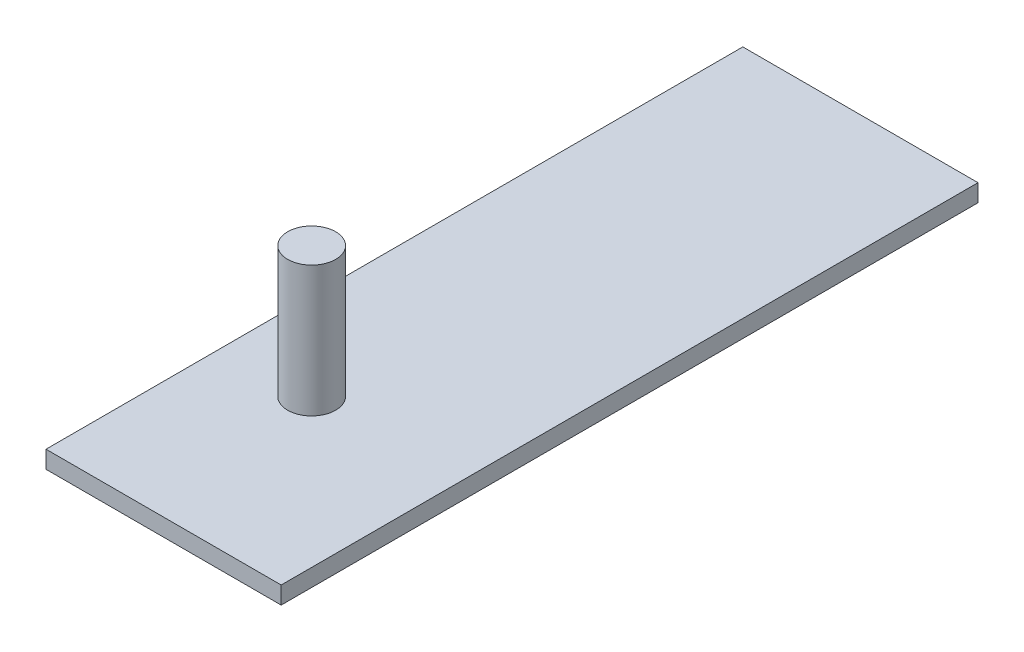
ISO-10303-21;
HEADER;
FILE_DESCRIPTION(('STEP AP214'),'2;1');
FILE_NAME('part.step','',(''),(''),'','','');
FILE_SCHEMA(('AUTOMOTIVE_DESIGN { 1 0 10303 214 1 1 1 1 }'));
ENDSEC;
DATA;
#1=APPLICATION_CONTEXT('core data for automotive mechanical design processes');
#2=APPLICATION_PROTOCOL_DEFINITION('international standard','automotive_design',2000,#1);
#3=PRODUCT_CONTEXT('',#1,'mechanical');
#4=PRODUCT('Part','Part','',(#3));
#5=PRODUCT_RELATED_PRODUCT_CATEGORY('part','',(#4));
#6=PRODUCT_DEFINITION_FORMATION('','',#4);
#7=PRODUCT_DEFINITION_CONTEXT('part definition',#1,'design');
#8=PRODUCT_DEFINITION('design','',#6,#7);
#9=PRODUCT_DEFINITION_SHAPE('','',#8);
#10=(LENGTH_UNIT() NAMED_UNIT(*) SI_UNIT(.MILLI.,.METRE.));
#11=(NAMED_UNIT(*) PLANE_ANGLE_UNIT() SI_UNIT($,.RADIAN.));
#12=(NAMED_UNIT(*) SI_UNIT($,.STERADIAN.) SOLID_ANGLE_UNIT());
#13=UNCERTAINTY_MEASURE_WITH_UNIT(LENGTH_MEASURE(1.E-05),#10,'distance_accuracy_value','');
#14=(GEOMETRIC_REPRESENTATION_CONTEXT(3) GLOBAL_UNCERTAINTY_ASSIGNED_CONTEXT((#13)) GLOBAL_UNIT_ASSIGNED_CONTEXT((#10,
#11,#12)) REPRESENTATION_CONTEXT('',''));
#15=CARTESIAN_POINT('',(0.,0.,0.));
#16=DIRECTION('',(0.,0.,1.));
#17=DIRECTION('',(1.,0.,0.));
#18=AXIS2_PLACEMENT_3D('',#15,#16,#17);
#19=CARTESIAN_POINT('',(0.,2.,0.));
#20=DIRECTION('',(0.,1.,0.));
#21=DIRECTION('',(0.,0.,1.));
#22=AXIS2_PLACEMENT_3D('',#19,#20,#21);
#23=PLANE('',#22);
#24=DIRECTION('',(0.,0.,1.));
#25=VECTOR('',#24,1.);
#26=CARTESIAN_POINT('',(-13.5,2.,40.));
#27=LINE('',#26,#25);
#28=CARTESIAN_POINT('',(-13.5,2.,-40.));
#29=VERTEX_POINT('',#28);
#30=CARTESIAN_POINT('',(-13.5,2.,40.));
#31=VERTEX_POINT('',#30);
#32=EDGE_CURVE('E87',#29,#31,#27,.T.);
#33=ORIENTED_EDGE('',*,*,#32,.T.);
#34=DIRECTION('',(1.,0.,0.));
#35=VECTOR('',#34,1.);
#36=CARTESIAN_POINT('',(13.5,2.,40.));
#37=LINE('',#36,#35);
#38=CARTESIAN_POINT('',(13.5,2.,40.));
#39=VERTEX_POINT('',#38);
#40=EDGE_CURVE('E82',#31,#39,#37,.T.);
#41=ORIENTED_EDGE('',*,*,#40,.T.);
#42=DIRECTION('',(0.,0.,-1.));
#43=VECTOR('',#42,1.);
#44=CARTESIAN_POINT('',(13.5,2.,40.));
#45=LINE('',#44,#43);
#46=CARTESIAN_POINT('',(13.5,2.,-40.));
#47=VERTEX_POINT('',#46);
#48=EDGE_CURVE('E85',#39,#47,#45,.T.);
#49=ORIENTED_EDGE('',*,*,#48,.T.);
#50=DIRECTION('',(-1.,0.,0.));
#51=VECTOR('',#50,1.);
#52=CARTESIAN_POINT('',(13.5,2.,-40.));
#53=LINE('',#52,#51);
#54=EDGE_CURVE('E52',#47,#29,#53,.T.);
#55=ORIENTED_EDGE('',*,*,#54,.T.);
#56=EDGE_LOOP('',(#33,#41,#49,#55));
#57=FACE_BOUND('',#56,.T.);
#58=CARTESIAN_POINT('',(-3.49999999999999,2.,19.5));
#59=DIRECTION('',(0.,1.,0.));
#60=DIRECTION('',(0.,0.,1.));
#61=AXIS2_PLACEMENT_3D('',#58,#59,#60);
#62=CIRCLE('',#61,2.75357296874713);
#63=CARTESIAN_POINT('',(-3.49999999999999,2.,22.2535729687471));
#64=VERTEX_POINT('',#63);
#65=EDGE_CURVE('E113',#64,#64,#62,.T.);
#66=ORIENTED_EDGE('',*,*,#65,.F.);
#67=EDGE_LOOP('',(#66));
#68=FACE_BOUND('',#67,.T.);
#69=ADVANCED_FACE('F35',(#57,#68),#23,.T.);
#70=CARTESIAN_POINT('',(-13.5,2.,40.));
#71=DIRECTION('',(1.,0.,0.));
#72=DIRECTION('',(0.,0.,-1.));
#73=AXIS2_PLACEMENT_3D('',#70,#71,#72);
#74=PLANE('',#73);
#75=DIRECTION('',(0.,0.,1.));
#76=VECTOR('',#75,1.);
#77=CARTESIAN_POINT('',(-13.5,0.,40.));
#78=LINE('',#77,#76);
#79=CARTESIAN_POINT('',(-13.5,0.,-40.));
#80=VERTEX_POINT('',#79);
#81=CARTESIAN_POINT('',(-13.5,0.,40.));
#82=VERTEX_POINT('',#81);
#83=EDGE_CURVE('E99',#80,#82,#78,.T.);
#84=ORIENTED_EDGE('',*,*,#83,.T.);
#85=DIRECTION('',(0.,-1.,0.));
#86=VECTOR('',#85,1.);
#87=CARTESIAN_POINT('',(-13.5,2.,40.));
#88=LINE('',#87,#86);
#89=EDGE_CURVE('E11',#31,#82,#88,.T.);
#90=ORIENTED_EDGE('',*,*,#89,.F.);
#91=ORIENTED_EDGE('',*,*,#32,.F.);
#92=DIRECTION('',(0.,-1.,0.));
#93=VECTOR('',#92,1.);
#94=CARTESIAN_POINT('',(-13.5,2.,-40.));
#95=LINE('',#94,#93);
#96=EDGE_CURVE('E95',#29,#80,#95,.T.);
#97=ORIENTED_EDGE('',*,*,#96,.T.);
#98=EDGE_LOOP('',(#84,#90,#91,#97));
#99=FACE_BOUND('',#98,.T.);
#100=ADVANCED_FACE('F37',(#99),#74,.F.);
#101=CARTESIAN_POINT('',(13.5,2.,40.));
#102=DIRECTION('',(0.,0.,-1.));
#103=DIRECTION('',(-1.,0.,0.));
#104=AXIS2_PLACEMENT_3D('',#101,#102,#103);
#105=PLANE('',#104);
#106=DIRECTION('',(1.,0.,0.));
#107=VECTOR('',#106,1.);
#108=CARTESIAN_POINT('',(13.5,0.,40.));
#109=LINE('',#108,#107);
#110=CARTESIAN_POINT('',(13.5,0.,40.));
#111=VERTEX_POINT('',#110);
#112=EDGE_CURVE('E91',#82,#111,#109,.T.);
#113=ORIENTED_EDGE('',*,*,#112,.T.);
#114=DIRECTION('',(0.,-1.,0.));
#115=VECTOR('',#114,1.);
#116=CARTESIAN_POINT('',(13.5,2.,40.));
#117=LINE('',#116,#115);
#118=EDGE_CURVE('E44',#39,#111,#117,.T.);
#119=ORIENTED_EDGE('',*,*,#118,.F.);
#120=ORIENTED_EDGE('',*,*,#40,.F.);
#121=ORIENTED_EDGE('',*,*,#89,.T.);
#122=EDGE_LOOP('',(#113,#119,#120,#121));
#123=FACE_BOUND('',#122,.T.);
#124=ADVANCED_FACE('F90',(#123),#105,.F.);
#125=CARTESIAN_POINT('',(13.5,2.,40.));
#126=DIRECTION('',(-1.,0.,0.));
#127=DIRECTION('',(0.,0.,1.));
#128=AXIS2_PLACEMENT_3D('',#125,#126,#127);
#129=PLANE('',#128);
#130=DIRECTION('',(0.,0.,-1.));
#131=VECTOR('',#130,1.);
#132=CARTESIAN_POINT('',(13.5,0.,40.));
#133=LINE('',#132,#131);
#134=CARTESIAN_POINT('',(13.5,0.,-40.));
#135=VERTEX_POINT('',#134);
#136=EDGE_CURVE('E69',#111,#135,#133,.T.);
#137=ORIENTED_EDGE('',*,*,#136,.T.);
#138=DIRECTION('',(0.,-1.,0.));
#139=VECTOR('',#138,1.);
#140=CARTESIAN_POINT('',(13.5,2.,-40.));
#141=LINE('',#140,#139);
#142=EDGE_CURVE('E92',#47,#135,#141,.T.);
#143=ORIENTED_EDGE('',*,*,#142,.F.);
#144=ORIENTED_EDGE('',*,*,#48,.F.);
#145=ORIENTED_EDGE('',*,*,#118,.T.);
#146=EDGE_LOOP('',(#137,#143,#144,#145));
#147=FACE_BOUND('',#146,.T.);
#148=ADVANCED_FACE('F93',(#147),#129,.F.);
#149=CARTESIAN_POINT('',(13.5,2.,-40.));
#150=DIRECTION('',(0.,0.,1.));
#151=DIRECTION('',(1.,0.,0.));
#152=AXIS2_PLACEMENT_3D('',#149,#150,#151);
#153=PLANE('',#152);
#154=DIRECTION('',(-1.,0.,0.));
#155=VECTOR('',#154,1.);
#156=CARTESIAN_POINT('',(13.5,0.,-40.));
#157=LINE('',#156,#155);
#158=EDGE_CURVE('E75',#135,#80,#157,.T.);
#159=ORIENTED_EDGE('',*,*,#158,.T.);
#160=ORIENTED_EDGE('',*,*,#96,.F.);
#161=ORIENTED_EDGE('',*,*,#54,.F.);
#162=ORIENTED_EDGE('',*,*,#142,.T.);
#163=EDGE_LOOP('',(#159,#160,#161,#162));
#164=FACE_BOUND('',#163,.T.);
#165=ADVANCED_FACE('F107',(#164),#153,.F.);
#166=CARTESIAN_POINT('',(0.,0.,0.));
#167=DIRECTION('',(0.,1.,0.));
#168=DIRECTION('',(0.,0.,1.));
#169=AXIS2_PLACEMENT_3D('',#166,#167,#168);
#170=PLANE('',#169);
#171=ORIENTED_EDGE('',*,*,#83,.F.);
#172=ORIENTED_EDGE('',*,*,#158,.F.);
#173=ORIENTED_EDGE('',*,*,#136,.F.);
#174=ORIENTED_EDGE('',*,*,#112,.F.);
#175=EDGE_LOOP('',(#171,#172,#173,#174));
#176=FACE_BOUND('',#175,.T.);
#177=ADVANCED_FACE('F110',(#176),#170,.F.);
#178=CARTESIAN_POINT('',(-3.49999999999999,17.,19.5));
#179=DIRECTION('',(0.,-1.,0.));
#180=DIRECTION('',(0.,0.,-1.));
#181=AXIS2_PLACEMENT_3D('',#178,#179,#180);
#182=CYLINDRICAL_SURFACE('',#181,2.75357296874713);
#183=CARTESIAN_POINT('',(-3.49999999999999,17.,19.5));
#184=DIRECTION('',(0.,1.,0.));
#185=DIRECTION('',(0.,0.,1.));
#186=AXIS2_PLACEMENT_3D('',#183,#184,#185);
#187=CIRCLE('',#186,2.75357296874713);
#188=CARTESIAN_POINT('',(-3.49999999999999,17.,22.2535729687471));
#189=VERTEX_POINT('',#188);
#190=EDGE_CURVE('E102',#189,#189,#187,.T.);
#191=ORIENTED_EDGE('',*,*,#190,.F.);
#192=EDGE_LOOP('',(#191));
#193=FACE_BOUND('',#192,.T.);
#194=ORIENTED_EDGE('',*,*,#65,.T.);
#195=EDGE_LOOP('',(#194));
#196=FACE_BOUND('',#195,.T.);
#197=ADVANCED_FACE('F121',(#193,#196),#182,.T.);
#198=CARTESIAN_POINT('',(-3.49999999999999,17.,19.5));
#199=DIRECTION('',(0.,1.,0.));
#200=DIRECTION('',(0.,0.,1.));
#201=AXIS2_PLACEMENT_3D('',#198,#199,#200);
#202=PLANE('',#201);
#203=ORIENTED_EDGE('',*,*,#190,.T.);
#204=EDGE_LOOP('',(#203));
#205=FACE_BOUND('',#204,.T.);
#206=ADVANCED_FACE('F119',(#205),#202,.T.);
#207=CLOSED_SHELL('',(#69,#100,#124,#148,#165,#177,#197,#206));
#208=MANIFOLD_SOLID_BREP('B2',#207);
#209=ADVANCED_BREP_SHAPE_REPRESENTATION('',(#18,#208),#14);
#210=SHAPE_DEFINITION_REPRESENTATION(#9,#209);
ENDSEC;
END-ISO-10303-21;
